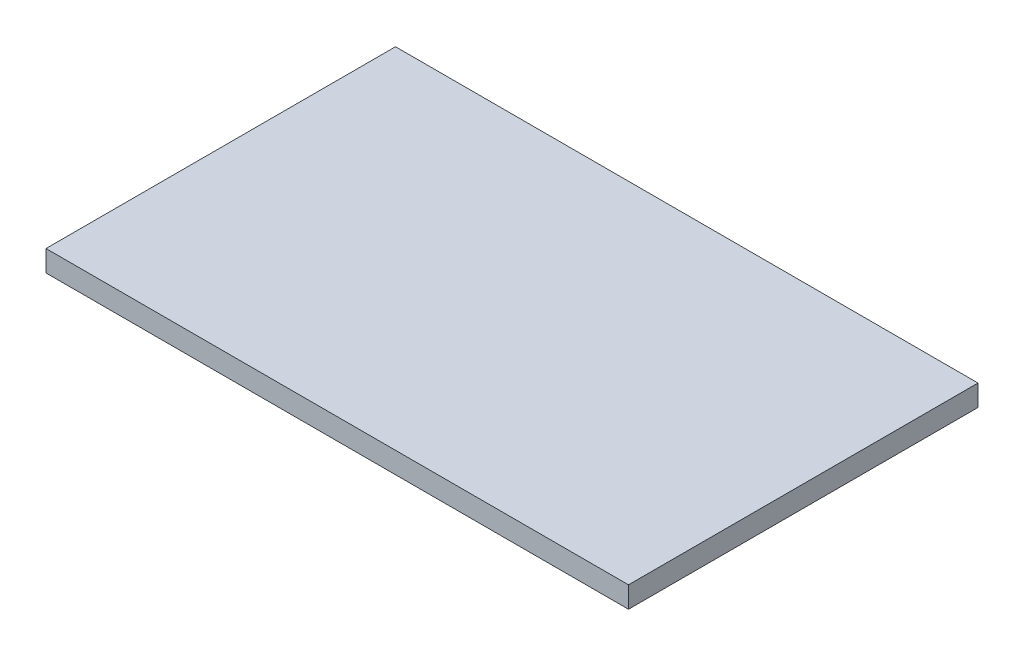
ISO-10303-21;
HEADER;
FILE_DESCRIPTION(('STEP AP214'),'2;1');
FILE_NAME('part.step','',(''),(''),'','','');
FILE_SCHEMA(('AUTOMOTIVE_DESIGN { 1 0 10303 214 1 1 1 1 }'));
ENDSEC;
DATA;
#1=APPLICATION_CONTEXT('core data for automotive mechanical design processes');
#2=APPLICATION_PROTOCOL_DEFINITION('international standard','automotive_design',2000,#1);
#3=PRODUCT_CONTEXT('',#1,'mechanical');
#4=PRODUCT('Part','Part','',(#3));
#5=PRODUCT_RELATED_PRODUCT_CATEGORY('part','',(#4));
#6=PRODUCT_DEFINITION_FORMATION('','',#4);
#7=PRODUCT_DEFINITION_CONTEXT('part definition',#1,'design');
#8=PRODUCT_DEFINITION('design','',#6,#7);
#9=PRODUCT_DEFINITION_SHAPE('','',#8);
#10=(LENGTH_UNIT() NAMED_UNIT(*) SI_UNIT(.MILLI.,.METRE.));
#11=(NAMED_UNIT(*) PLANE_ANGLE_UNIT() SI_UNIT($,.RADIAN.));
#12=(NAMED_UNIT(*) SI_UNIT($,.STERADIAN.) SOLID_ANGLE_UNIT());
#13=UNCERTAINTY_MEASURE_WITH_UNIT(LENGTH_MEASURE(1.E-05),#10,'distance_accuracy_value','');
#14=(GEOMETRIC_REPRESENTATION_CONTEXT(3) GLOBAL_UNCERTAINTY_ASSIGNED_CONTEXT((#13)) GLOBAL_UNIT_ASSIGNED_CONTEXT((#10,
#11,#12)) REPRESENTATION_CONTEXT('',''));
#15=CARTESIAN_POINT('',(0.,0.,0.));
#16=DIRECTION('',(0.,0.,1.));
#17=DIRECTION('',(1.,0.,0.));
#18=AXIS2_PLACEMENT_3D('',#15,#16,#17);
#19=CARTESIAN_POINT('',(0.,20.,0.));
#20=DIRECTION('',(1.,0.,0.));
#21=DIRECTION('',(0.,0.,-1.));
#22=AXIS2_PLACEMENT_3D('',#19,#20,#21);
#23=PLANE('',#22);
#24=DIRECTION('',(0.,0.,1.));
#25=VECTOR('',#24,1.);
#26=CARTESIAN_POINT('',(0.,0.,0.));
#27=LINE('',#26,#25);
#28=CARTESIAN_POINT('',(0.,0.,-330.));
#29=VERTEX_POINT('',#28);
#30=CARTESIAN_POINT('',(0.,0.,0.));
#31=VERTEX_POINT('',#30);
#32=EDGE_CURVE('E145',#29,#31,#27,.T.);
#33=ORIENTED_EDGE('',*,*,#32,.T.);
#34=DIRECTION('',(0.,-1.,0.));
#35=VECTOR('',#34,1.);
#36=CARTESIAN_POINT('',(0.,20.,0.));
#37=LINE('',#36,#35);
#38=CARTESIAN_POINT('',(0.,20.,0.));
#39=VERTEX_POINT('',#38);
#40=EDGE_CURVE('E11',#39,#31,#37,.T.);
#41=ORIENTED_EDGE('',*,*,#40,.F.);
#42=DIRECTION('',(0.,0.,1.));
#43=VECTOR('',#42,1.);
#44=CARTESIAN_POINT('',(0.,20.,0.));
#45=LINE('',#44,#43);
#46=CARTESIAN_POINT('',(0.,20.,-330.));
#47=VERTEX_POINT('',#46);
#48=EDGE_CURVE('E149',#47,#39,#45,.T.);
#49=ORIENTED_EDGE('',*,*,#48,.F.);
#50=DIRECTION('',(0.,-1.,0.));
#51=VECTOR('',#50,1.);
#52=CARTESIAN_POINT('',(0.,20.,-330.));
#53=LINE('',#52,#51);
#54=EDGE_CURVE('E155',#47,#29,#53,.T.);
#55=ORIENTED_EDGE('',*,*,#54,.T.);
#56=EDGE_LOOP('',(#33,#41,#49,#55));
#57=FACE_BOUND('',#56,.T.);
#58=ADVANCED_FACE('F37',(#57),#23,.F.);
#59=CARTESIAN_POINT('',(0.,20.,0.));
#60=DIRECTION('',(0.,0.,-1.));
#61=DIRECTION('',(-1.,0.,0.));
#62=AXIS2_PLACEMENT_3D('',#59,#60,#61);
#63=PLANE('',#62);
#64=DIRECTION('',(1.,0.,0.));
#65=VECTOR('',#64,1.);
#66=CARTESIAN_POINT('',(0.,0.,0.));
#67=LINE('',#66,#65);
#68=CARTESIAN_POINT('',(550.,0.,0.));
#69=VERTEX_POINT('',#68);
#70=EDGE_CURVE('E158',#31,#69,#67,.T.);
#71=ORIENTED_EDGE('',*,*,#70,.T.);
#72=DIRECTION('',(0.,-1.,0.));
#73=VECTOR('',#72,1.);
#74=CARTESIAN_POINT('',(550.,20.,0.));
#75=LINE('',#74,#73);
#76=CARTESIAN_POINT('',(550.,20.,0.));
#77=VERTEX_POINT('',#76);
#78=EDGE_CURVE('E44',#77,#69,#75,.T.);
#79=ORIENTED_EDGE('',*,*,#78,.F.);
#80=DIRECTION('',(1.,0.,0.));
#81=VECTOR('',#80,1.);
#82=CARTESIAN_POINT('',(0.,20.,0.));
#83=LINE('',#82,#81);
#84=EDGE_CURVE('E88',#39,#77,#83,.T.);
#85=ORIENTED_EDGE('',*,*,#84,.F.);
#86=ORIENTED_EDGE('',*,*,#40,.T.);
#87=EDGE_LOOP('',(#71,#79,#85,#86));
#88=FACE_BOUND('',#87,.T.);
#89=ADVANCED_FACE('F186',(#88),#63,.F.);
#90=CARTESIAN_POINT('',(550.,20.,0.));
#91=DIRECTION('',(-1.,0.,0.));
#92=DIRECTION('',(0.,0.,1.));
#93=AXIS2_PLACEMENT_3D('',#90,#91,#92);
#94=PLANE('',#93);
#95=DIRECTION('',(0.,0.,-1.));
#96=VECTOR('',#95,1.);
#97=CARTESIAN_POINT('',(550.,0.,0.));
#98=LINE('',#97,#96);
#99=CARTESIAN_POINT('',(550.,0.,-330.));
#100=VERTEX_POINT('',#99);
#101=EDGE_CURVE('E160',#69,#100,#98,.T.);
#102=ORIENTED_EDGE('',*,*,#101,.T.);
#103=DIRECTION('',(0.,-1.,0.));
#104=VECTOR('',#103,1.);
#105=CARTESIAN_POINT('',(550.,20.,-330.));
#106=LINE('',#105,#104);
#107=CARTESIAN_POINT('',(550.,20.,-330.));
#108=VERTEX_POINT('',#107);
#109=EDGE_CURVE('E164',#108,#100,#106,.T.);
#110=ORIENTED_EDGE('',*,*,#109,.F.);
#111=DIRECTION('',(0.,0.,-1.));
#112=VECTOR('',#111,1.);
#113=CARTESIAN_POINT('',(550.,20.,0.));
#114=LINE('',#113,#112);
#115=EDGE_CURVE('E152',#77,#108,#114,.T.);
#116=ORIENTED_EDGE('',*,*,#115,.F.);
#117=ORIENTED_EDGE('',*,*,#78,.T.);
#118=EDGE_LOOP('',(#102,#110,#116,#117));
#119=FACE_BOUND('',#118,.T.);
#120=ADVANCED_FACE('F169',(#119),#94,.F.);
#121=CARTESIAN_POINT('',(0.,20.,-330.));
#122=DIRECTION('',(0.,0.,1.));
#123=DIRECTION('',(1.,0.,0.));
#124=AXIS2_PLACEMENT_3D('',#121,#122,#123);
#125=PLANE('',#124);
#126=DIRECTION('',(-1.,0.,0.));
#127=VECTOR('',#126,1.);
#128=CARTESIAN_POINT('',(0.,0.,-330.));
#129=LINE('',#128,#127);
#130=EDGE_CURVE('E81',#100,#29,#129,.T.);
#131=ORIENTED_EDGE('',*,*,#130,.T.);
#132=ORIENTED_EDGE('',*,*,#54,.F.);
#133=DIRECTION('',(-1.,0.,0.));
#134=VECTOR('',#133,1.);
#135=CARTESIAN_POINT('',(0.,20.,-330.));
#136=LINE('',#135,#134);
#137=EDGE_CURVE('E60',#108,#47,#136,.T.);
#138=ORIENTED_EDGE('',*,*,#137,.F.);
#139=ORIENTED_EDGE('',*,*,#109,.T.);
#140=EDGE_LOOP('',(#131,#132,#138,#139));
#141=FACE_BOUND('',#140,.T.);
#142=ADVANCED_FACE('F177',(#141),#125,.F.);
#143=CARTESIAN_POINT('',(0.,20.,0.));
#144=DIRECTION('',(0.,-1.,0.));
#145=DIRECTION('',(0.,0.,-1.));
#146=AXIS2_PLACEMENT_3D('',#143,#144,#145);
#147=PLANE('',#146);
#148=ORIENTED_EDGE('',*,*,#48,.T.);
#149=ORIENTED_EDGE('',*,*,#84,.T.);
#150=ORIENTED_EDGE('',*,*,#115,.T.);
#151=ORIENTED_EDGE('',*,*,#137,.T.);
#152=EDGE_LOOP('',(#148,#149,#150,#151));
#153=FACE_BOUND('',#152,.T.);
#154=ADVANCED_FACE('F179',(#153),#147,.F.);
#155=CARTESIAN_POINT('',(0.,0.,0.));
#156=DIRECTION('',(0.,-1.,0.));
#157=DIRECTION('',(0.,0.,-1.));
#158=AXIS2_PLACEMENT_3D('',#155,#156,#157);
#159=PLANE('',#158);
#160=DIRECTION('',(0.,0.,-1.));
#161=VECTOR('',#160,1.);
#162=CARTESIAN_POINT('',(9.99999999999996,0.,-10.));
#163=LINE('',#162,#161);
#164=CARTESIAN_POINT('',(9.99999999999996,0.,-10.));
#165=VERTEX_POINT('',#164);
#166=CARTESIAN_POINT('',(10.,0.,-320.));
#167=VERTEX_POINT('',#166);
#168=EDGE_CURVE('E51',#165,#167,#163,.T.);
#169=ORIENTED_EDGE('',*,*,#168,.F.);
#170=DIRECTION('',(-1.,0.,0.));
#171=VECTOR('',#170,1.);
#172=CARTESIAN_POINT('',(9.99999999999996,0.,-10.));
#173=LINE('',#172,#171);
#174=CARTESIAN_POINT('',(540.,0.,-10.));
#175=VERTEX_POINT('',#174);
#176=EDGE_CURVE('E130',#175,#165,#173,.T.);
#177=ORIENTED_EDGE('',*,*,#176,.F.);
#178=DIRECTION('',(0.,0.,1.));
#179=VECTOR('',#178,1.);
#180=CARTESIAN_POINT('',(540.,0.,-10.));
#181=LINE('',#180,#179);
#182=CARTESIAN_POINT('',(540.,0.,-320.));
#183=VERTEX_POINT('',#182);
#184=EDGE_CURVE('E133',#183,#175,#181,.T.);
#185=ORIENTED_EDGE('',*,*,#184,.F.);
#186=DIRECTION('',(1.,0.,0.));
#187=VECTOR('',#186,1.);
#188=CARTESIAN_POINT('',(10.,0.,-320.));
#189=LINE('',#188,#187);
#190=EDGE_CURVE('E139',#167,#183,#189,.T.);
#191=ORIENTED_EDGE('',*,*,#190,.F.);
#192=EDGE_LOOP('',(#169,#177,#185,#191));
#193=FACE_BOUND('',#192,.T.);
#194=ORIENTED_EDGE('',*,*,#32,.F.);
#195=ORIENTED_EDGE('',*,*,#130,.F.);
#196=ORIENTED_EDGE('',*,*,#101,.F.);
#197=ORIENTED_EDGE('',*,*,#70,.F.);
#198=EDGE_LOOP('',(#194,#195,#196,#197));
#199=FACE_BOUND('',#198,.T.);
#200=ADVANCED_FACE('F173',(#193,#199),#159,.T.);
#201=CARTESIAN_POINT('',(9.99999999999996,3.,-10.));
#202=DIRECTION('',(-1.,0.,0.));
#203=DIRECTION('',(0.,0.,1.));
#204=AXIS2_PLACEMENT_3D('',#201,#202,#203);
#205=PLANE('',#204);
#206=ORIENTED_EDGE('',*,*,#168,.T.);
#207=DIRECTION('',(0.,-1.,0.));
#208=VECTOR('',#207,1.);
#209=CARTESIAN_POINT('',(10.,3.,-320.));
#210=LINE('',#209,#208);
#211=CARTESIAN_POINT('',(10.,3.,-320.));
#212=VERTEX_POINT('',#211);
#213=EDGE_CURVE('E108',#212,#167,#210,.T.);
#214=ORIENTED_EDGE('',*,*,#213,.F.);
#215=DIRECTION('',(0.,0.,-1.));
#216=VECTOR('',#215,1.);
#217=CARTESIAN_POINT('',(9.99999999999996,3.,-10.));
#218=LINE('',#217,#216);
#219=CARTESIAN_POINT('',(9.99999999999996,3.,-10.));
#220=VERTEX_POINT('',#219);
#221=EDGE_CURVE('E112',#220,#212,#218,.T.);
#222=ORIENTED_EDGE('',*,*,#221,.F.);
#223=DIRECTION('',(0.,-1.,0.));
#224=VECTOR('',#223,1.);
#225=CARTESIAN_POINT('',(9.99999999999996,3.,-10.));
#226=LINE('',#225,#224);
#227=EDGE_CURVE('E143',#220,#165,#226,.T.);
#228=ORIENTED_EDGE('',*,*,#227,.T.);
#229=EDGE_LOOP('',(#206,#214,#222,#228));
#230=FACE_BOUND('',#229,.T.);
#231=ADVANCED_FACE('F110',(#230),#205,.F.);
#232=CARTESIAN_POINT('',(9.99999999999996,3.,-10.));
#233=DIRECTION('',(0.,0.,1.));
#234=DIRECTION('',(1.,0.,0.));
#235=AXIS2_PLACEMENT_3D('',#232,#233,#234);
#236=PLANE('',#235);
#237=ORIENTED_EDGE('',*,*,#176,.T.);
#238=ORIENTED_EDGE('',*,*,#227,.F.);
#239=DIRECTION('',(-1.,0.,0.));
#240=VECTOR('',#239,1.);
#241=CARTESIAN_POINT('',(9.99999999999996,3.,-10.));
#242=LINE('',#241,#240);
#243=CARTESIAN_POINT('',(540.,3.,-10.));
#244=VERTEX_POINT('',#243);
#245=EDGE_CURVE('E118',#244,#220,#242,.T.);
#246=ORIENTED_EDGE('',*,*,#245,.F.);
#247=DIRECTION('',(0.,-1.,0.));
#248=VECTOR('',#247,1.);
#249=CARTESIAN_POINT('',(540.,3.,-10.));
#250=LINE('',#249,#248);
#251=EDGE_CURVE('E146',#244,#175,#250,.T.);
#252=ORIENTED_EDGE('',*,*,#251,.T.);
#253=EDGE_LOOP('',(#237,#238,#246,#252));
#254=FACE_BOUND('',#253,.T.);
#255=ADVANCED_FACE('F226',(#254),#236,.F.);
#256=CARTESIAN_POINT('',(540.,3.,-10.));
#257=DIRECTION('',(1.,0.,0.));
#258=DIRECTION('',(0.,0.,-1.));
#259=AXIS2_PLACEMENT_3D('',#256,#257,#258);
#260=PLANE('',#259);
#261=ORIENTED_EDGE('',*,*,#184,.T.);
#262=ORIENTED_EDGE('',*,*,#251,.F.);
#263=DIRECTION('',(0.,0.,1.));
#264=VECTOR('',#263,1.);
#265=CARTESIAN_POINT('',(540.,3.,-10.));
#266=LINE('',#265,#264);
#267=CARTESIAN_POINT('',(540.,3.,-320.));
#268=VERTEX_POINT('',#267);
#269=EDGE_CURVE('E126',#268,#244,#266,.T.);
#270=ORIENTED_EDGE('',*,*,#269,.F.);
#271=DIRECTION('',(0.,-1.,0.));
#272=VECTOR('',#271,1.);
#273=CARTESIAN_POINT('',(540.,3.,-320.));
#274=LINE('',#273,#272);
#275=EDGE_CURVE('E117',#268,#183,#274,.T.);
#276=ORIENTED_EDGE('',*,*,#275,.T.);
#277=EDGE_LOOP('',(#261,#262,#270,#276));
#278=FACE_BOUND('',#277,.T.);
#279=ADVANCED_FACE('F235',(#278),#260,.F.);
#280=CARTESIAN_POINT('',(10.,3.,-320.));
#281=DIRECTION('',(0.,0.,-1.));
#282=DIRECTION('',(-1.,0.,0.));
#283=AXIS2_PLACEMENT_3D('',#280,#281,#282);
#284=PLANE('',#283);
#285=ORIENTED_EDGE('',*,*,#190,.T.);
#286=ORIENTED_EDGE('',*,*,#275,.F.);
#287=DIRECTION('',(1.,0.,0.));
#288=VECTOR('',#287,1.);
#289=CARTESIAN_POINT('',(10.,3.,-320.));
#290=LINE('',#289,#288);
#291=EDGE_CURVE('E121',#212,#268,#290,.T.);
#292=ORIENTED_EDGE('',*,*,#291,.F.);
#293=ORIENTED_EDGE('',*,*,#213,.T.);
#294=EDGE_LOOP('',(#285,#286,#292,#293));
#295=FACE_BOUND('',#294,.T.);
#296=ADVANCED_FACE('F122',(#295),#284,.F.);
#297=CARTESIAN_POINT('',(0.,3.,0.));
#298=DIRECTION('',(0.,-1.,0.));
#299=DIRECTION('',(0.,0.,-1.));
#300=AXIS2_PLACEMENT_3D('',#297,#298,#299);
#301=PLANE('',#300);
#302=ORIENTED_EDGE('',*,*,#221,.T.);
#303=ORIENTED_EDGE('',*,*,#291,.T.);
#304=ORIENTED_EDGE('',*,*,#269,.T.);
#305=ORIENTED_EDGE('',*,*,#245,.T.);
#306=EDGE_LOOP('',(#302,#303,#304,#305));
#307=FACE_BOUND('',#306,.T.);
#308=ADVANCED_FACE('F128',(#307),#301,.T.);
#309=CLOSED_SHELL('',(#58,#89,#120,#142,#154,#200,#231,#255,#279,#296,#308));
#310=MANIFOLD_SOLID_BREP('B2',#309);
#311=ADVANCED_BREP_SHAPE_REPRESENTATION('',(#18,#310),#14);
#312=SHAPE_DEFINITION_REPRESENTATION(#9,#311);
ENDSEC;
END-ISO-10303-21;
